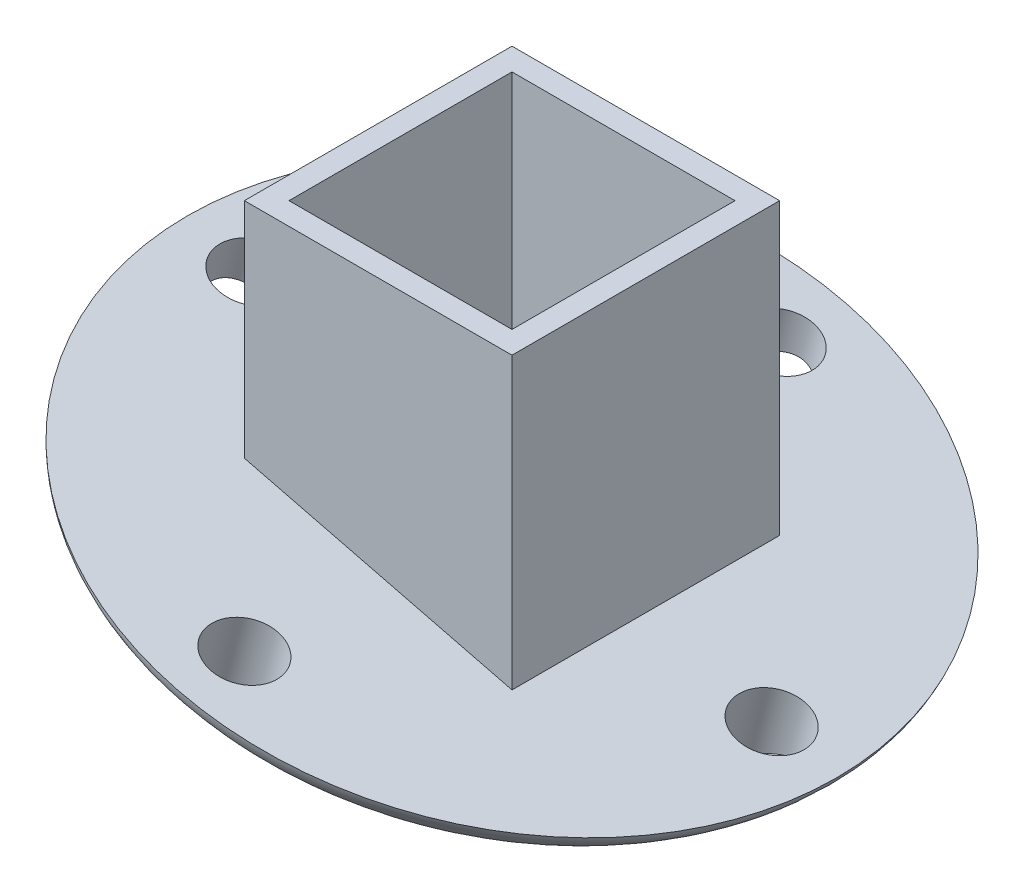
ISO-10303-21;
HEADER;
FILE_DESCRIPTION(('STEP AP214'),'2;1');
FILE_NAME('part.step','',(''),(''),'','','');
FILE_SCHEMA(('AUTOMOTIVE_DESIGN { 1 0 10303 214 1 1 1 1 }'));
ENDSEC;
DATA;
#1=APPLICATION_CONTEXT('core data for automotive mechanical design processes');
#2=APPLICATION_PROTOCOL_DEFINITION('international standard','automotive_design',2000,#1);
#3=PRODUCT_CONTEXT('',#1,'mechanical');
#4=PRODUCT('Part','Part','',(#3));
#5=PRODUCT_RELATED_PRODUCT_CATEGORY('part','',(#4));
#6=PRODUCT_DEFINITION_FORMATION('','',#4);
#7=PRODUCT_DEFINITION_CONTEXT('part definition',#1,'design');
#8=PRODUCT_DEFINITION('design','',#6,#7);
#9=PRODUCT_DEFINITION_SHAPE('','',#8);
#10=(LENGTH_UNIT() NAMED_UNIT(*) SI_UNIT(.MILLI.,.METRE.));
#11=(NAMED_UNIT(*) PLANE_ANGLE_UNIT() SI_UNIT($,.RADIAN.));
#12=(NAMED_UNIT(*) SI_UNIT($,.STERADIAN.) SOLID_ANGLE_UNIT());
#13=UNCERTAINTY_MEASURE_WITH_UNIT(LENGTH_MEASURE(1.E-05),#10,'distance_accuracy_value','');
#14=(GEOMETRIC_REPRESENTATION_CONTEXT(3) GLOBAL_UNCERTAINTY_ASSIGNED_CONTEXT((#13)) GLOBAL_UNIT_ASSIGNED_CONTEXT((#10,
#11,#12)) REPRESENTATION_CONTEXT('',''));
#15=CARTESIAN_POINT('',(0.,0.,0.));
#16=DIRECTION('',(0.,0.,1.));
#17=DIRECTION('',(1.,0.,0.));
#18=AXIS2_PLACEMENT_3D('',#15,#16,#17);
#19=CARTESIAN_POINT('',(-6.,10.,-6.));
#20=DIRECTION('',(0.,0.,1.));
#21=DIRECTION('',(1.,0.,0.));
#22=AXIS2_PLACEMENT_3D('',#19,#20,#21);
#23=PLANE('',#22);
#24=DIRECTION('',(0.970142500145332,-0.242535625036333,0.));
#25=VECTOR('',#24,1.);
#26=CARTESIAN_POINT('',(-0.352941176470588,-1.41176470588235,-6.));
#27=LINE('',#26,#25);
#28=CARTESIAN_POINT('',(-6.,0.,-6.));
#29=VERTEX_POINT('',#28);
#30=CARTESIAN_POINT('',(6.,-3.,-6.));
#31=VERTEX_POINT('',#30);
#32=EDGE_CURVE('E275',#29,#31,#27,.T.);
#33=ORIENTED_EDGE('',*,*,#32,.F.);
#34=DIRECTION('',(0.,-1.,0.));
#35=VECTOR('',#34,1.);
#36=CARTESIAN_POINT('',(-6.,10.,-6.));
#37=LINE('',#36,#35);
#38=CARTESIAN_POINT('',(-6.,10.,-6.));
#39=VERTEX_POINT('',#38);
#40=EDGE_CURVE('E56',#39,#29,#37,.T.);
#41=ORIENTED_EDGE('',*,*,#40,.F.);
#42=DIRECTION('',(-1.,0.,0.));
#43=VECTOR('',#42,1.);
#44=CARTESIAN_POINT('',(-6.,10.,-6.));
#45=LINE('',#44,#43);
#46=CARTESIAN_POINT('',(6.,10.,-6.));
#47=VERTEX_POINT('',#46);
#48=EDGE_CURVE('E207',#47,#39,#45,.T.);
#49=ORIENTED_EDGE('',*,*,#48,.F.);
#50=DIRECTION('',(0.,-1.,0.));
#51=VECTOR('',#50,1.);
#52=CARTESIAN_POINT('',(6.,10.,-6.));
#53=LINE('',#52,#51);
#54=EDGE_CURVE('E11',#47,#31,#53,.T.);
#55=ORIENTED_EDGE('',*,*,#54,.T.);
#56=EDGE_LOOP('',(#33,#41,#49,#55));
#57=FACE_BOUND('',#56,.T.);
#58=ADVANCED_FACE('F41',(#57),#23,.F.);
#59=CARTESIAN_POINT('',(-6.,10.,-6.));
#60=DIRECTION('',(1.,0.,0.));
#61=DIRECTION('',(0.,0.,-1.));
#62=AXIS2_PLACEMENT_3D('',#59,#60,#61);
#63=PLANE('',#62);
#64=DIRECTION('',(0.,0.,1.));
#65=VECTOR('',#64,1.);
#66=CARTESIAN_POINT('',(-6.,0.,-6.));
#67=LINE('',#66,#65);
#68=CARTESIAN_POINT('',(-6.,0.,6.));
#69=VERTEX_POINT('',#68);
#70=EDGE_CURVE('E283',#29,#69,#67,.T.);
#71=ORIENTED_EDGE('',*,*,#70,.T.);
#72=DIRECTION('',(0.,-1.,0.));
#73=VECTOR('',#72,1.);
#74=CARTESIAN_POINT('',(-6.,10.,6.));
#75=LINE('',#74,#73);
#76=CARTESIAN_POINT('',(-6.,10.,6.));
#77=VERTEX_POINT('',#76);
#78=EDGE_CURVE('E219',#77,#69,#75,.T.);
#79=ORIENTED_EDGE('',*,*,#78,.F.);
#80=DIRECTION('',(0.,0.,1.));
#81=VECTOR('',#80,1.);
#82=CARTESIAN_POINT('',(-6.,10.,-6.));
#83=LINE('',#82,#81);
#84=EDGE_CURVE('E210',#39,#77,#83,.T.);
#85=ORIENTED_EDGE('',*,*,#84,.F.);
#86=ORIENTED_EDGE('',*,*,#40,.T.);
#87=EDGE_LOOP('',(#71,#79,#85,#86));
#88=FACE_BOUND('',#87,.T.);
#89=ADVANCED_FACE('F137',(#88),#63,.F.);
#90=CARTESIAN_POINT('',(-6.,10.,6.));
#91=DIRECTION('',(0.,0.,-1.));
#92=DIRECTION('',(-1.,0.,0.));
#93=AXIS2_PLACEMENT_3D('',#90,#91,#92);
#94=PLANE('',#93);
#95=DIRECTION('',(0.970142500145332,-0.242535625036333,0.));
#96=VECTOR('',#95,1.);
#97=CARTESIAN_POINT('',(-0.352941176470588,-1.41176470588235,6.));
#98=LINE('',#97,#96);
#99=CARTESIAN_POINT('',(6.,-3.,6.));
#100=VERTEX_POINT('',#99);
#101=EDGE_CURVE('E271',#69,#100,#98,.T.);
#102=ORIENTED_EDGE('',*,*,#101,.T.);
#103=DIRECTION('',(0.,-1.,0.));
#104=VECTOR('',#103,1.);
#105=CARTESIAN_POINT('',(6.,10.,6.));
#106=LINE('',#105,#104);
#107=CARTESIAN_POINT('',(6.,10.,6.));
#108=VERTEX_POINT('',#107);
#109=EDGE_CURVE('E215',#108,#100,#106,.T.);
#110=ORIENTED_EDGE('',*,*,#109,.F.);
#111=DIRECTION('',(1.,0.,0.));
#112=VECTOR('',#111,1.);
#113=CARTESIAN_POINT('',(-6.,10.,6.));
#114=LINE('',#113,#112);
#115=EDGE_CURVE('E72',#77,#108,#114,.T.);
#116=ORIENTED_EDGE('',*,*,#115,.F.);
#117=ORIENTED_EDGE('',*,*,#78,.T.);
#118=EDGE_LOOP('',(#102,#110,#116,#117));
#119=FACE_BOUND('',#118,.T.);
#120=ADVANCED_FACE('F142',(#119),#94,.F.);
#121=CARTESIAN_POINT('',(0.,10.,0.));
#122=DIRECTION('',(0.,1.,0.));
#123=DIRECTION('',(0.,0.,1.));
#124=AXIS2_PLACEMENT_3D('',#121,#122,#123);
#125=PLANE('',#124);
#126=DIRECTION('',(0.,0.,-1.));
#127=VECTOR('',#126,1.);
#128=CARTESIAN_POINT('',(6.,10.,-6.));
#129=LINE('',#128,#127);
#130=EDGE_CURVE('E204',#108,#47,#129,.T.);
#131=ORIENTED_EDGE('',*,*,#130,.T.);
#132=ORIENTED_EDGE('',*,*,#48,.T.);
#133=ORIENTED_EDGE('',*,*,#84,.T.);
#134=ORIENTED_EDGE('',*,*,#115,.T.);
#135=EDGE_LOOP('',(#131,#132,#133,#134));
#136=FACE_BOUND('',#135,.T.);
#137=DIRECTION('',(-1.,0.,0.));
#138=VECTOR('',#137,1.);
#139=CARTESIAN_POINT('',(-5.00000000000001,10.,-5.));
#140=LINE('',#139,#138);
#141=CARTESIAN_POINT('',(5.,10.,-5.));
#142=VERTEX_POINT('',#141);
#143=CARTESIAN_POINT('',(-5.00000000000001,10.,-5.));
#144=VERTEX_POINT('',#143);
#145=EDGE_CURVE('E185',#142,#144,#140,.T.);
#146=ORIENTED_EDGE('',*,*,#145,.F.);
#147=DIRECTION('',(0.,0.,-1.));
#148=VECTOR('',#147,1.);
#149=CARTESIAN_POINT('',(5.,10.,5.));
#150=LINE('',#149,#148);
#151=CARTESIAN_POINT('',(5.,10.,5.));
#152=VERTEX_POINT('',#151);
#153=EDGE_CURVE('E181',#152,#142,#150,.T.);
#154=ORIENTED_EDGE('',*,*,#153,.F.);
#155=DIRECTION('',(1.,0.,0.));
#156=VECTOR('',#155,1.);
#157=CARTESIAN_POINT('',(-5.00000000000001,10.,5.));
#158=LINE('',#157,#156);
#159=CARTESIAN_POINT('',(-5.00000000000001,10.,5.));
#160=VERTEX_POINT('',#159);
#161=EDGE_CURVE('E194',#160,#152,#158,.T.);
#162=ORIENTED_EDGE('',*,*,#161,.F.);
#163=DIRECTION('',(0.,0.,1.));
#164=VECTOR('',#163,1.);
#165=CARTESIAN_POINT('',(-5.00000000000001,10.,5.));
#166=LINE('',#165,#164);
#167=EDGE_CURVE('E294',#144,#160,#166,.T.);
#168=ORIENTED_EDGE('',*,*,#167,.F.);
#169=EDGE_LOOP('',(#146,#154,#162,#168));
#170=FACE_BOUND('',#169,.T.);
#171=ADVANCED_FACE('F149',(#136,#170),#125,.T.);
#172=CARTESIAN_POINT('',(6.,10.,-6.));
#173=DIRECTION('',(-1.,0.,0.));
#174=DIRECTION('',(0.,0.,1.));
#175=AXIS2_PLACEMENT_3D('',#172,#173,#174);
#176=PLANE('',#175);
#177=ORIENTED_EDGE('',*,*,#109,.T.);
#178=DIRECTION('',(0.,0.,-1.));
#179=VECTOR('',#178,1.);
#180=CARTESIAN_POINT('',(6.,-3.,-6.));
#181=LINE('',#180,#179);
#182=EDGE_CURVE('E288',#100,#31,#181,.T.);
#183=ORIENTED_EDGE('',*,*,#182,.T.);
#184=ORIENTED_EDGE('',*,*,#54,.F.);
#185=ORIENTED_EDGE('',*,*,#130,.F.);
#186=EDGE_LOOP('',(#177,#183,#184,#185));
#187=FACE_BOUND('',#186,.T.);
#188=ADVANCED_FACE('F43',(#187),#176,.F.);
#189=CARTESIAN_POINT('',(5.,10.,5.));
#190=DIRECTION('',(-1.,0.,0.));
#191=DIRECTION('',(0.,0.,1.));
#192=AXIS2_PLACEMENT_3D('',#189,#190,#191);
#193=PLANE('',#192);
#194=DIRECTION('',(0.,0.,-1.));
#195=VECTOR('',#194,1.);
#196=CARTESIAN_POINT('',(5.,0.,5.));
#197=LINE('',#196,#195);
#198=CARTESIAN_POINT('',(5.,0.,5.));
#199=VERTEX_POINT('',#198);
#200=CARTESIAN_POINT('',(5.,0.,-5.));
#201=VERTEX_POINT('',#200);
#202=EDGE_CURVE('E177',#199,#201,#197,.T.);
#203=ORIENTED_EDGE('',*,*,#202,.F.);
#204=DIRECTION('',(0.,-1.,0.));
#205=VECTOR('',#204,1.);
#206=CARTESIAN_POINT('',(5.,10.,5.));
#207=LINE('',#206,#205);
#208=EDGE_CURVE('E191',#152,#199,#207,.T.);
#209=ORIENTED_EDGE('',*,*,#208,.F.);
#210=ORIENTED_EDGE('',*,*,#153,.T.);
#211=DIRECTION('',(0.,-1.,0.));
#212=VECTOR('',#211,1.);
#213=CARTESIAN_POINT('',(5.,10.,-5.));
#214=LINE('',#213,#212);
#215=EDGE_CURVE('E200',#142,#201,#214,.T.);
#216=ORIENTED_EDGE('',*,*,#215,.T.);
#217=EDGE_LOOP('',(#203,#209,#210,#216));
#218=FACE_BOUND('',#217,.T.);
#219=ADVANCED_FACE('F153',(#218),#193,.T.);
#220=CARTESIAN_POINT('',(-5.00000000000001,10.,-5.));
#221=DIRECTION('',(0.,0.,1.));
#222=DIRECTION('',(1.,0.,0.));
#223=AXIS2_PLACEMENT_3D('',#220,#221,#222);
#224=PLANE('',#223);
#225=DIRECTION('',(-1.,0.,0.));
#226=VECTOR('',#225,1.);
#227=CARTESIAN_POINT('',(-5.00000000000001,0.,-5.));
#228=LINE('',#227,#226);
#229=CARTESIAN_POINT('',(-5.00000000000001,0.,-5.));
#230=VERTEX_POINT('',#229);
#231=EDGE_CURVE('E187',#201,#230,#228,.T.);
#232=ORIENTED_EDGE('',*,*,#231,.F.);
#233=ORIENTED_EDGE('',*,*,#215,.F.);
#234=ORIENTED_EDGE('',*,*,#145,.T.);
#235=DIRECTION('',(0.,-1.,0.));
#236=VECTOR('',#235,1.);
#237=CARTESIAN_POINT('',(-5.00000000000001,10.,-5.));
#238=LINE('',#237,#236);
#239=EDGE_CURVE('E197',#144,#230,#238,.T.);
#240=ORIENTED_EDGE('',*,*,#239,.T.);
#241=EDGE_LOOP('',(#232,#233,#234,#240));
#242=FACE_BOUND('',#241,.T.);
#243=ADVANCED_FACE('F156',(#242),#224,.T.);
#244=CARTESIAN_POINT('',(-5.00000000000001,10.,5.));
#245=DIRECTION('',(1.,0.,0.));
#246=DIRECTION('',(0.,0.,-1.));
#247=AXIS2_PLACEMENT_3D('',#244,#245,#246);
#248=PLANE('',#247);
#249=DIRECTION('',(0.,0.,1.));
#250=VECTOR('',#249,1.);
#251=CARTESIAN_POINT('',(-5.00000000000001,0.,5.));
#252=LINE('',#251,#250);
#253=CARTESIAN_POINT('',(-5.00000000000001,0.,5.));
#254=VERTEX_POINT('',#253);
#255=EDGE_CURVE('E179',#230,#254,#252,.T.);
#256=ORIENTED_EDGE('',*,*,#255,.F.);
#257=ORIENTED_EDGE('',*,*,#239,.F.);
#258=ORIENTED_EDGE('',*,*,#167,.T.);
#259=DIRECTION('',(0.,-1.,0.));
#260=VECTOR('',#259,1.);
#261=CARTESIAN_POINT('',(-5.00000000000001,10.,5.));
#262=LINE('',#261,#260);
#263=EDGE_CURVE('E64',#160,#254,#262,.T.);
#264=ORIENTED_EDGE('',*,*,#263,.T.);
#265=EDGE_LOOP('',(#256,#257,#258,#264));
#266=FACE_BOUND('',#265,.T.);
#267=ADVANCED_FACE('F160',(#266),#248,.T.);
#268=CARTESIAN_POINT('',(-5.00000000000001,10.,5.));
#269=DIRECTION('',(0.,0.,-1.));
#270=DIRECTION('',(-1.,0.,0.));
#271=AXIS2_PLACEMENT_3D('',#268,#269,#270);
#272=PLANE('',#271);
#273=DIRECTION('',(1.,0.,0.));
#274=VECTOR('',#273,1.);
#275=CARTESIAN_POINT('',(-5.00000000000001,0.,5.));
#276=LINE('',#275,#274);
#277=EDGE_CURVE('E174',#254,#199,#276,.T.);
#278=ORIENTED_EDGE('',*,*,#277,.F.);
#279=ORIENTED_EDGE('',*,*,#263,.F.);
#280=ORIENTED_EDGE('',*,*,#161,.T.);
#281=ORIENTED_EDGE('',*,*,#208,.T.);
#282=EDGE_LOOP('',(#278,#279,#280,#281));
#283=FACE_BOUND('',#282,.T.);
#284=ADVANCED_FACE('F164',(#283),#272,.T.);
#285=CARTESIAN_POINT('',(-6.,0.,6.));
#286=DIRECTION('',(0.,1.,0.));
#287=DIRECTION('',(0.,0.,1.));
#288=AXIS2_PLACEMENT_3D('',#285,#286,#287);
#289=PLANE('',#288);
#290=ORIENTED_EDGE('',*,*,#277,.T.);
#291=ORIENTED_EDGE('',*,*,#202,.T.);
#292=ORIENTED_EDGE('',*,*,#231,.T.);
#293=ORIENTED_EDGE('',*,*,#255,.T.);
#294=EDGE_LOOP('',(#290,#291,#292,#293));
#295=FACE_BOUND('',#294,.T.);
#296=ADVANCED_FACE('F128',(#295),#289,.T.);
#297=CARTESIAN_POINT('',(-0.352941176470588,-1.41176470588235,0.));
#298=DIRECTION('',(0.242535625036333,0.970142500145332,0.));
#299=DIRECTION('',(-0.970142500145332,0.242535625036333,0.));
#300=AXIS2_PLACEMENT_3D('',#297,#298,#299);
#301=PLANE('',#300);
#302=CARTESIAN_POINT('',(0.00015603088864718,-1.50003900772216,-12.0001638046084));
#303=DIRECTION('',(0.242535625036333,0.970142500145332,0.));
#304=DIRECTION('',(-0.970142500145332,0.242535625036333,0.));
#305=AXIS2_PLACEMENT_3D('',#302,#303,#304);
#306=CIRCLE('',#305,1.5);
#307=CARTESIAN_POINT('',(-1.45505771932935,-1.13623557016766,-12.0001638046084));
#308=VERTEX_POINT('',#307);
#309=EDGE_CURVE('E234',#308,#308,#306,.T.);
#310=ORIENTED_EDGE('',*,*,#309,.F.);
#311=EDGE_LOOP('',(#310));
#312=FACE_BOUND('',#311,.T.);
#313=CARTESIAN_POINT('',(11.6418660326326,-4.41046650815816,-0.000163804608414419));
#314=DIRECTION('',(0.242535625036333,0.970142500145332,0.));
#315=DIRECTION('',(-0.970142500145332,0.242535625036333,0.));
#316=AXIS2_PLACEMENT_3D('',#313,#314,#315);
#317=CIRCLE('',#316,1.5);
#318=CARTESIAN_POINT('',(10.1866522824146,-4.04666307060366,-0.000163804608414419));
#319=VERTEX_POINT('',#318);
#320=EDGE_CURVE('E422',#319,#319,#317,.T.);
#321=ORIENTED_EDGE('',*,*,#320,.F.);
#322=EDGE_LOOP('',(#321));
#323=FACE_BOUND('',#322,.T.);
#324=CARTESIAN_POINT('',(0.00015603088864718,-1.50003900772216,11.9998361953916));
#325=DIRECTION('',(0.242535625036333,0.970142500145332,0.));
#326=DIRECTION('',(-0.970142500145332,0.242535625036333,0.));
#327=AXIS2_PLACEMENT_3D('',#324,#325,#326);
#328=CIRCLE('',#327,1.5);
#329=CARTESIAN_POINT('',(-1.45505771932935,-1.13623557016766,11.9998361953916));
#330=VERTEX_POINT('',#329);
#331=EDGE_CURVE('E426',#330,#330,#328,.T.);
#332=ORIENTED_EDGE('',*,*,#331,.F.);
#333=EDGE_LOOP('',(#332));
#334=FACE_BOUND('',#333,.T.);
#335=CARTESIAN_POINT('',(-11.6415539708553,1.41038849271383,-0.000163804608414419));
#336=DIRECTION('',(0.242535625036333,0.970142500145332,0.));
#337=DIRECTION('',(-0.970142500145332,0.242535625036333,0.));
#338=AXIS2_PLACEMENT_3D('',#335,#336,#337);
#339=CIRCLE('',#338,1.5);
#340=CARTESIAN_POINT('',(-13.0967677210733,1.77419193026833,-0.000163804608414419));
#341=VERTEX_POINT('',#340);
#342=EDGE_CURVE('E431',#341,#341,#339,.T.);
#343=ORIENTED_EDGE('',*,*,#342,.F.);
#344=EDGE_LOOP('',(#343));
#345=FACE_BOUND('',#344,.T.);
#346=CARTESIAN_POINT('',(0.,-1.5,0.));
#347=DIRECTION('',(0.242535625036333,0.970142500145332,0.));
#348=DIRECTION('',(-0.970142500145332,0.242535625036333,0.));
#349=AXIS2_PLACEMENT_3D('',#346,#347,#348);
#350=CIRCLE('',#349,15.);
#351=CARTESIAN_POINT('',(-14.55213750218,2.13803437554499,0.));
#352=VERTEX_POINT('',#351);
#353=EDGE_CURVE('E259',#352,#352,#350,.T.);
#354=ORIENTED_EDGE('',*,*,#353,.T.);
#355=EDGE_LOOP('',(#354));
#356=FACE_BOUND('',#355,.T.);
#357=ORIENTED_EDGE('',*,*,#32,.T.);
#358=ORIENTED_EDGE('',*,*,#182,.F.);
#359=ORIENTED_EDGE('',*,*,#101,.F.);
#360=ORIENTED_EDGE('',*,*,#70,.F.);
#361=EDGE_LOOP('',(#357,#358,#359,#360));
#362=FACE_BOUND('',#361,.T.);
#363=ADVANCED_FACE('F119',(#312,#323,#334,#345,#356,#362),#301,.T.);
#364=CARTESIAN_POINT('',(-1.21267812518167,-6.35071250072666,0.));
#365=CARTESIAN_POINT('',(4.87585189508166,-8.18182814171305,0.));
#366=CARTESIAN_POINT('',(13.570451870267,-7.28992498295824,0.));
#367=CARTESIAN_POINT('',(14.55213750218,-5.13803437554499,0.));
#368=B_SPLINE_CURVE_WITH_KNOTS('',3,(#364,#365,#366,#367),.UNSPECIFIED.,.F.,.F.,(4,4),(0.,1.),.UNSPECIFIED.);
#369=CARTESIAN_POINT('',(0.,-1.5,0.));
#370=DIRECTION('',(0.242535625036333,0.970142500145332,0.));
#371=AXIS1_PLACEMENT('',#369,#370);
#372=SURFACE_OF_REVOLUTION('',#368,#371);
#373=CARTESIAN_POINT('',(-2.06508250236672,-3.57633470231713,-12.0001638046084));
#374=CARTESIAN_POINT('',(-2.07570926135557,-3.61885405525407,-11.9097810736468));
#375=CARTESIAN_POINT('',(-2.0782999157834,-3.66294645538454,-11.8191109238702));
#376=CARTESIAN_POINT('',(-2.06697564977122,-3.75328785753917,-11.6397742327925));
#377=CARTESIAN_POINT('',(-2.0530410372454,-3.799539369293,-11.5511102104724));
#378=CARTESIAN_POINT('',(-2.00844271684533,-3.8932190876555,-11.3783885537887));
#379=CARTESIAN_POINT('',(-1.97773702585009,-3.94064996096369,-11.2943430645785));
#380=CARTESIAN_POINT('',(-1.89982253121877,-4.03531391825591,-11.1341530928361));
#381=CARTESIAN_POINT('',(-1.8526226915812,-4.08254709559935,-11.0580043477874));
#382=CARTESIAN_POINT('',(-1.7461267779568,-4.17238735386059,-10.921321265508));
#383=CARTESIAN_POINT('',(-1.68780432187643,-4.21509655319141,-10.860097539401));
#384=CARTESIAN_POINT('',(-1.55881048932638,-4.29771640283371,-10.749995209712));
#385=CARTESIAN_POINT('',(-1.48814692242145,-4.33762880073732,-10.7011088464878));
#386=CARTESIAN_POINT('',(-1.3436312162053,-4.40968003696713,-10.6219482513085));
#387=CARTESIAN_POINT('',(-1.27068131122901,-4.44219649212093,-10.590369108904));
#388=CARTESIAN_POINT('',(-1.11852146548128,-4.50261169852462,-10.5408137984953));
#389=CARTESIAN_POINT('',(-1.03931484475961,-4.53051287481663,-10.5228304688867));
#390=CARTESIAN_POINT('',(-0.883098362674248,-4.57889380094717,-10.5021152587698));
#391=CARTESIAN_POINT('',(-0.806340742414625,-4.59976318008784,-10.4983787736533));
#392=CARTESIAN_POINT('',(-0.651971752357561,-4.63603739104789,-10.5035274954151));
#393=CARTESIAN_POINT('',(-0.574360553006626,-4.65144329412232,-10.5124102262597));
#394=CARTESIAN_POINT('',(-0.422429379076436,-4.6760712616145,-10.5420428657619));
#395=CARTESIAN_POINT('',(-0.348075083012574,-4.68543240403952,-10.5625038848067));
#396=CARTESIAN_POINT('',(-0.202719328477029,-4.6983759691424,-10.6142526209622));
#397=CARTESIAN_POINT('',(-0.131718128479358,-4.70195794703584,-10.645541171172));
#398=CARTESIAN_POINT('',(0.00715884954159278,-4.70338438524486,-10.7188152099125));
#399=CARTESIAN_POINT('',(0.0748894227351547,-4.70106369549137,-10.7610782271913));
#400=CARTESIAN_POINT('',(0.203511548616489,-4.69054028068598,-10.8543488292724));
#401=CARTESIAN_POINT('',(0.264401360912113,-4.68233606267838,-10.9053586310864));
#402=CARTESIAN_POINT('',(0.382077154369427,-4.65963000666649,-11.0182481675976));
#403=CARTESIAN_POINT('',(0.438305722853431,-4.6447392089265,-11.0806301668456));
#404=CARTESIAN_POINT('',(0.540732634905144,-4.60913962801605,-11.2116297642729));
#405=CARTESIAN_POINT('',(0.586927484416796,-4.58842882387699,-11.2802495228739));
#406=CARTESIAN_POINT('',(0.67220914782978,-4.53972447708158,-11.4280244476037));
#407=CARTESIAN_POINT('',(0.710341661490256,-4.51125746211514,-11.5075780327075));
#408=CARTESIAN_POINT('',(0.757763445164942,-4.46451578951361,-11.6290486106142));
#409=CARTESIAN_POINT('',(0.771944401506497,-4.44825542005135,-11.6699099220132));
#410=CARTESIAN_POINT('',(0.79704557197021,-4.41446245939526,-11.7521495677205));
#411=CARTESIAN_POINT('',(0.80796302529689,-4.39692880654929,-11.7935283091019));
#412=CARTESIAN_POINT('',(0.837212534791551,-4.33973901906409,-11.9245223619297));
#413=CARTESIAN_POINT('',(0.849531271289291,-4.29793520402797,-12.0146159781257));
#414=CARTESIAN_POINT('',(0.858735764142675,-4.20994733329772,-12.1934543029685));
#415=CARTESIAN_POINT('',(0.855617515487223,-4.16376214393726,-12.282198655568));
#416=CARTESIAN_POINT('',(0.839219983847563,-4.09102077743255,-12.414445754568));
#417=CARTESIAN_POINT('',(0.831499061888499,-4.06561385575469,-12.4593306623922));
#418=CARTESIAN_POINT('',(0.81191277073509,-4.01412292139423,-12.5477257195155));
#419=CARTESIAN_POINT('',(0.800051319545441,-3.98803957031146,-12.5912371262053));
#420=CARTESIAN_POINT('',(0.758257239183354,-3.90898440838488,-12.7193304565994));
#421=CARTESIAN_POINT('',(0.722112179252508,-3.85519538875965,-12.8014934878128));
#422=CARTESIAN_POINT('',(0.634475403005637,-3.74834230518075,-12.9549661355103));
#423=CARTESIAN_POINT('',(0.583278303061206,-3.69528311290004,-13.026447638002));
#424=CARTESIAN_POINT('',(0.46588683741277,-3.5909985158439,-13.1575384188019));
#425=CARTESIAN_POINT('',(0.399701329655897,-3.53977204857553,-13.2171546703722));
#426=CARTESIAN_POINT('',(0.260652677562865,-3.44656119051237,-13.31638787641));
#427=CARTESIAN_POINT('',(0.189055443591069,-3.40416214823099,-13.3573818582202));
#428=CARTESIAN_POINT('',(0.0363767667366677,-3.3253422028003,-13.4248617563238));
#429=CARTESIAN_POINT('',(-0.0446909672050028,-3.28891283754552,-13.4513683354901));
#430=CARTESIAN_POINT('',(-0.201710774717878,-3.22876099159879,-13.4855245568913));
#431=CARTESIAN_POINT('',(-0.276799485034982,-3.20397491237458,-13.495288523835));
#432=CARTESIAN_POINT('',(-0.429520606184575,-3.16154849974178,-13.5021903689893));
#433=CARTESIAN_POINT('',(-0.507151697605604,-3.14390452140192,-13.499334696453));
#434=CARTESIAN_POINT('',(-0.655938474797681,-3.11740045326152,-13.4819318975352));
#435=CARTESIAN_POINT('',(-0.727105490328196,-3.10794093674788,-13.4683581068292));
#436=CARTESIAN_POINT('',(-0.867405491036786,-3.095396077888,-13.4313894574142));
#437=CARTESIAN_POINT('',(-0.936538247364744,-3.09231145002205,-13.4079934982166));
#438=CARTESIAN_POINT('',(-1.07352168057487,-3.0921106798103,-13.351364897947));
#439=CARTESIAN_POINT('',(-1.14123917722463,-3.09521084719031,-13.3178118246943));
#440=CARTESIAN_POINT('',(-1.27134908554642,-3.10715503073513,-13.2424601344271));
#441=CARTESIAN_POINT('',(-1.33373973150647,-3.11600094316535,-13.2006587984147));
#442=CARTESIAN_POINT('',(-1.45891752343635,-3.14001955988875,-13.1048940750252));
#443=CARTESIAN_POINT('',(-1.52094318809346,-3.15579726208727,-13.0500882578083));
#444=CARTESIAN_POINT('',(-1.63614046366241,-3.19266963120245,-12.9333954597378));
#445=CARTESIAN_POINT('',(-1.68930546776478,-3.21376823636731,-12.8715032525247));
#446=CARTESIAN_POINT('',(-1.79208432830925,-3.26338719438765,-12.7340494070071));
#447=CARTESIAN_POINT('',(-1.84041887026471,-3.2925061992532,-12.6577466651803));
#448=CARTESIAN_POINT('',(-1.92407066415542,-3.3554078665341,-12.5001805700517));
#449=CARTESIAN_POINT('',(-1.95939743355715,-3.38918709420241,-12.4189208945652));
#450=CARTESIAN_POINT('',(-2.00689446611083,-3.4485775392406,-12.2811271021007));
#451=CARTESIAN_POINT('',(-2.02285782377137,-3.47314031363358,-12.2254166615751));
#452=CARTESIAN_POINT('',(-2.0486252899828,-3.52370801592576,-12.1132296710625));
#453=CARTESIAN_POINT('',(-2.05842901320878,-3.5497130339359,-12.0567530733732));
#454=CARTESIAN_POINT('',(-2.06508250236672,-3.57633470231713,-12.0001638046084));
#455=B_SPLINE_CURVE_WITH_KNOTS('',3,(#373,#374,#375,#376,#377,#378,#379,#380,#381,#382,#383,
#384,#385,#386,#387,#388,#389,#390,#391,#392,#393,#394,#395,#396,#397,#398,#399,#400,#401,#402,
#403,#404,#405,#406,#407,#408,#409,#410,#411,#412,#413,#414,#415,#416,#417,#418,#419,#420,#421,
#422,#423,#424,#425,#426,#427,#428,#429,#430,#431,#432,#433,#434,#435,#436,#437,#438,#439,#440,
#441,#442,#443,#444,#445,#446,#447,#448,#449,#450,#451,#452,#453,#454),.UNSPECIFIED.,.T.,.F.,(4,
2,2,2,2,2,2,2,2,2,2,2,2,2,2,2,2,2,2,2,2,2,2,2,2,2,2,2,2,2,2,2,2,2,2,2,2,2,2,2,4),(0.,
0.301127380287923,0.60261395534899,0.904858725454481,1.20693949079638,1.48958511035166,
1.77205251307275,2.02834522657351,2.28450284345621,2.5222226579133,2.75989583547992,
2.99188494724983,3.2238919128496,3.46246114291527,3.70109093177545,3.95588576548274,
4.21076918500451,4.48759546527642,4.62610389111868,4.76472916019406,5.06356802167173,
5.36248441873413,5.51877091816581,5.67490992950858,5.98711317515048,6.29357186941668,
6.59984992119176,6.87649061326487,7.15273570592168,7.39045408750072,7.62805099741281,
7.84625416830154,8.0644817934859,8.29047558222865,8.51654399351258,8.76831632470396,
9.02027555405783,9.30380020281509,9.58711698940583,9.77564318515977,9.96418117327128),.UNSPECIFIED.);
#456=CARTESIAN_POINT('',(-2.06508250236672,-3.57633470231713,-12.0001638046084));
#457=VERTEX_POINT('',#456);
#458=EDGE_CURVE('E45',#457,#457,#455,.T.);
#459=ORIENTED_EDGE('',*,*,#458,.T.);
#460=EDGE_LOOP('',(#459));
#461=FACE_BOUND('',#460,.T.);
#462=CARTESIAN_POINT('',(9.41005322576052,-7.15305933409709,0.));
#463=CARTESIAN_POINT('',(9.41006941899355,-7.15305722646124,0.0789878514329336));
#464=CARTESIAN_POINT('',(9.41682803571438,-7.15192191873802,0.15807255495309));
#465=CARTESIAN_POINT('',(9.43684575338882,-7.1485476885247,0.274869803251598));
#466=CARTESIAN_POINT('',(9.44517802557453,-7.14714219376934,0.313534360978657));
#467=CARTESIAN_POINT('',(9.46505253013118,-7.14378323416358,0.390038769759902));
#468=CARTESIAN_POINT('',(9.47659700261086,-7.1418293868975,0.42787802533781));
#469=CARTESIAN_POINT('',(9.51580316098304,-7.13517832476997,0.539478705091778));
#470=CARTESIAN_POINT('',(9.54808892800292,-7.12968301685159,0.611617366305611));
#471=CARTESIAN_POINT('',(9.62377735015598,-7.11670535025652,0.749614342506858));
#472=CARTESIAN_POINT('',(9.66718488838031,-7.10922211871483,0.815469881371066));
#473=CARTESIAN_POINT('',(9.74023606811729,-7.09651059865532,0.909441278611763));
#474=CARTESIAN_POINT('',(9.76639645951258,-7.09193976012974,0.940417701257967));
#475=CARTESIAN_POINT('',(9.82102153335799,-7.08234670226048,1.0001339442402));
#476=CARTESIAN_POINT('',(9.84948387663127,-7.07732494057355,1.02887597825304));
#477=CARTESIAN_POINT('',(9.93806417760001,-7.06160831980705,1.11162159079718));
#478=CARTESIAN_POINT('',(10.0013744498168,-7.05026229047599,1.16214345997597));
#479=CARTESIAN_POINT('',(10.1398494479203,-7.02510489596261,1.25660327331421));
#480=CARTESIAN_POINT('',(10.2155550596085,-7.01116975942925,1.2997096489434));
#481=CARTESIAN_POINT('',(10.3724868815052,-6.98179077077821,1.37357756151257));
#482=CARTESIAN_POINT('',(10.45371515095,-6.96634635494555,1.40433446385053));
#483=CARTESIAN_POINT('',(10.6268508985039,-6.93279696203409,1.45535287350182));
#484=CARTESIAN_POINT('',(10.7190747014705,-6.91457740439292,1.47447801266119));
#485=CARTESIAN_POINT('',(10.8585283892854,-6.88639492343527,1.49196557195616));
#486=CARTESIAN_POINT('',(10.9052145411815,-6.87685535347992,1.49592753542201));
#487=CARTESIAN_POINT('',(10.9987472226663,-6.85751916715756,1.50014662454431));
#488=CARTESIAN_POINT('',(11.0455938614514,-6.8477223186034,1.50040027978883));
#489=CARTESIAN_POINT('',(11.1921876867792,-6.81668894057617,1.49539846142353));
#490=CARTESIAN_POINT('',(11.2917024778734,-6.79507386572368,1.48357185346583));
#491=CARTESIAN_POINT('',(11.4872522243262,-6.75140342231851,1.44340817983025));
#492=CARTESIAN_POINT('',(11.5832869938289,-6.72934803034729,1.41507023371492));
#493=CARTESIAN_POINT('',(11.7236465884317,-6.69618770663447,1.36021867868713));
#494=CARTESIAN_POINT('',(11.7703097846485,-6.68499784681054,1.33957926414588));
#495=CARTESIAN_POINT('',(11.8616020930625,-6.6627863798622,1.29424312401964));
#496=CARTESIAN_POINT('',(11.9062330588596,-6.65176462576973,1.26955019434035));
#497=CARTESIAN_POINT('',(12.0366040382183,-6.6190976263641,1.18946244331407));
#498=CARTESIAN_POINT('',(12.1188685778087,-6.5978396295802,1.12804064593072));
#499=CARTESIAN_POINT('',(12.2666524902816,-6.55862905131694,0.993863324228971));
#500=CARTESIAN_POINT('',(12.3328114770283,-6.54056324284036,0.921844694812341));
#501=CARTESIAN_POINT('',(12.4503732330309,-6.5077769554041,0.76593354127267));
#502=CARTESIAN_POINT('',(12.5017924165686,-6.49305275905454,0.682054381789754));
#503=CARTESIAN_POINT('',(12.5813784908132,-6.46992481933791,0.515933519209379));
#504=CARTESIAN_POINT('',(12.6116346441623,-6.46096460346625,0.43477231002807));
#505=CARTESIAN_POINT('',(12.6564178996233,-6.44761519595767,0.267880740810395));
#506=CARTESIAN_POINT('',(12.6709633200424,-6.44322068106028,0.182155824633027));
#507=CARTESIAN_POINT('',(12.6825252210281,-6.4397287530049,0.0205397383611952));
#508=CARTESIAN_POINT('',(12.6815528192651,-6.44002358024045,-0.0552005940572943));
#509=CARTESIAN_POINT('',(12.6669774871771,-6.44441839214482,-0.205332521603643));
#510=CARTESIAN_POINT('',(12.6533764943715,-6.44851779310355,-0.279724321842729));
#511=CARTESIAN_POINT('',(12.6149514955669,-6.45996972184811,-0.422571469818561));
#512=CARTESIAN_POINT('',(12.5905167753756,-6.46720923591546,-0.49114204763904));
#513=CARTESIAN_POINT('',(12.5316576218493,-6.48439387766769,-0.623468531154467));
#514=CARTESIAN_POINT('',(12.4972309362561,-6.49433961532253,-0.687223347255574));
#515=CARTESIAN_POINT('',(12.416736806023,-6.51718845805745,-0.813367719862113));
#516=CARTESIAN_POINT('',(12.3699858912333,-6.53025833948203,-0.875289356566794));
#517=CARTESIAN_POINT('',(12.2679668492576,-6.55817953018365,-0.991343793545477));
#518=CARTESIAN_POINT('',(12.2126834794224,-6.57303401680071,-1.04546231269153));
#519=CARTESIAN_POINT('',(12.0877895720236,-6.60584505013603,-1.15141752066844));
#520=CARTESIAN_POINT('',(12.0172516388381,-6.62395685421819,-1.20211320431685));
#521=CARTESIAN_POINT('',(11.8694270745572,-6.66094143141662,-1.29201892052654));
#522=CARTESIAN_POINT('',(11.792139812545,-6.67981427558481,-1.33122787783101));
#523=CARTESIAN_POINT('',(11.6236792125997,-6.71991288144688,-1.40145981057247));
#524=CARTESIAN_POINT('',(11.5319209822921,-6.74116496166406,-1.43106989719993));
#525=CARTESIAN_POINT('',(11.3446971474319,-6.78336478003023,-1.4750684025757));
#526=CARTESIAN_POINT('',(11.2492286006247,-6.80431225776778,-1.48944447455979));
#527=CARTESIAN_POINT('',(11.0515460701876,-6.84660403708092,-1.50296834804754));
#528=CARTESIAN_POINT('',(10.9492585273808,-6.86790253754032,-1.50119837154761));
#529=CARTESIAN_POINT('',(10.7463617096627,-6.90914205695501,-1.47995272908423));
#530=CARTESIAN_POINT('',(10.6457498863952,-6.92908531330191,-1.46050704698847));
#531=CARTESIAN_POINT('',(10.4989915691157,-6.95756977380672,-1.41831167436627));
#532=CARTESIAN_POINT('',(10.4509947450135,-6.96678370256284,-1.40218776032347));
#533=CARTESIAN_POINT('',(10.3565913703378,-6.98472963101787,-1.36569228989535));
#534=CARTESIAN_POINT('',(10.3101837815173,-6.99346194772211,-1.34532357075041));
#535=CARTESIAN_POINT('',(10.1739349917378,-7.01886779687067,-1.27790555278825));
#536=CARTESIAN_POINT('',(10.0869638330819,-7.03477027344816,-1.22451483952593));
#537=CARTESIAN_POINT('',(9.93006783517018,-7.06305101479725,-1.10614929670501));
#538=CARTESIAN_POINT('',(9.85938424690797,-7.07559585130661,-1.04221544185555));
#539=CARTESIAN_POINT('',(9.73086649514072,-7.09817117655187,-0.902077782579535));
#540=CARTESIAN_POINT('',(9.67302773494931,-7.10820256492274,-0.82587838442705));
#541=CARTESIAN_POINT('',(9.57765379474047,-7.12462558894528,-0.671038353902304));
#542=CARTESIAN_POINT('',(9.53873664367807,-7.13126784269614,-0.593273406239242));
#543=CARTESIAN_POINT('',(9.47562389619068,-7.14199723427861,-0.431915616295246));
#544=CARTESIAN_POINT('',(9.45139699579779,-7.14608980583176,-0.348335592557288));
#545=CARTESIAN_POINT('',(9.4267650501151,-7.15024486810756,-0.219934533123465));
#546=CARTESIAN_POINT('',(9.4205041623017,-7.15129947505274,-0.176196188824909));
#547=CARTESIAN_POINT('',(9.41214376839412,-7.15270728959544,-0.0883153203337027));
#548=CARTESIAN_POINT('',(9.41004416993087,-7.15306051276173,-0.0441728051343744));
#549=CARTESIAN_POINT('',(9.41005322576052,-7.15305933409709,0.));
#550=B_SPLINE_CURVE_WITH_KNOTS('',3,(#462,#463,#464,#465,#466,#467,#468,#469,#470,#471,#472,
#473,#474,#475,#476,#477,#478,#479,#480,#481,#482,#483,#484,#485,#486,#487,#488,#489,#490,#491,
#492,#493,#494,#495,#496,#497,#498,#499,#500,#501,#502,#503,#504,#505,#506,#507,#508,#509,#510,
#511,#512,#513,#514,#515,#516,#517,#518,#519,#520,#521,#522,#523,#524,#525,#526,#527,#528,#529,
#530,#531,#532,#533,#534,#535,#536,#537,#538,#539,#540,#541,#542,#543,#544,#545,#546,#547,#548,
#549),.UNSPECIFIED.,.T.,.F.,(4,2,2,2,2,2,2,2,2,2,2,2,2,2,2,2,2,2,2,2,2,2,2,2,2,2,2,2,2,2,2,2,2,
2,2,2,2,2,2,2,2,2,2,4),(0.,0.236766207332289,0.355382773665918,0.474082268471434,
0.710596221671704,0.947214196451925,1.06950612540089,1.19167530965077,1.43601830299113,
1.69959944043343,1.96327940431244,2.24974076633482,2.39306405391567,2.53652146169695,
2.84260281107552,3.14870048318623,3.30523352219046,3.46162080372339,3.77424439420619,
4.07093987464661,4.36730365920308,4.62701415366884,4.88642150445775,5.11251708215212,
5.33857797726011,5.5571021458478,5.77567560960434,6.01077967011377,6.24630869601911,
6.51143007860703,6.77657627092207,7.07148476485524,7.3666320919099,7.67865633106476,
7.99015225923581,8.14436830754197,8.29848160610249,8.60638319371401,8.89324339696155,
9.18000077759122,9.44026971736237,9.69998207382,9.83239306499655,9.96480111698382),.UNSPECIFIED.);
#551=CARTESIAN_POINT('',(9.41005322576052,-7.15305933409709,0.));
#552=VERTEX_POINT('',#551);
#553=EDGE_CURVE('E250',#552,#552,#550,.T.);
#554=ORIENTED_EDGE('',*,*,#553,.T.);
#555=EDGE_LOOP('',(#554));
#556=FACE_BOUND('',#555,.T.);
#557=CARTESIAN_POINT('',(-2.06512103091131,-3.57648881649551,11.9998361953916));
#558=CARTESIAN_POINT('',(-2.05413850682103,-3.53257039095086,12.0931985440923));
#559=CARTESIAN_POINT('',(-2.03456048595209,-3.49025805666319,12.186408495798));
#560=CARTESIAN_POINT('',(-1.97880636583176,-3.4099386431276,12.3698170251453));
#561=CARTESIAN_POINT('',(-1.94260154906412,-3.37193915515292,12.4600101017499));
#562=CARTESIAN_POINT('',(-1.85435450914285,-3.30141406201767,12.6347425448698));
#563=CARTESIAN_POINT('',(-1.8023003977539,-3.26889259434828,12.7192776091647));
#564=CARTESIAN_POINT('',(-1.68340065639661,-3.21069539976111,12.8799048284154));
#565=CARTESIAN_POINT('',(-1.61655990998528,-3.18501741881535,12.9559997584512));
#566=CARTESIAN_POINT('',(-1.4725229383914,-3.14295526321197,13.0939961900686));
#567=CARTESIAN_POINT('',(-1.39586287209687,-3.12623355910869,13.1563513171244));
#568=CARTESIAN_POINT('',(-1.23211996668325,-3.10215620145348,13.267836804884));
#569=CARTESIAN_POINT('',(-1.14504700748883,-3.09479174553188,13.3169795601063));
#570=CARTESIAN_POINT('',(-0.974156592124004,-3.09123945218843,13.3942780701894));
#571=CARTESIAN_POINT('',(-0.8911819987024,-3.09382738239095,13.4242338904204));
#572=CARTESIAN_POINT('',(-0.722188400245242,-3.10829052282776,13.4698551245053));
#573=CARTESIAN_POINT('',(-0.636173341635563,-3.12015408773004,13.4855384037952));
#574=CARTESIAN_POINT('',(-0.475906200956635,-3.15101482426683,13.5005091064919));
#575=CARTESIAN_POINT('',(-0.4016033473009,-3.1688606395993,13.5016911076656));
#576=CARTESIAN_POINT('',(-0.255613342975216,-3.21103271563935,13.4924659137538));
#577=CARTESIAN_POINT('',(-0.18392563521414,-3.23535758687266,13.4820612019917));
#578=CARTESIAN_POINT('',(-0.0482930432983361,-3.28829648145056,13.4509306834838));
#579=CARTESIAN_POINT('',(0.0158532887912681,-3.31667666865743,13.4306756859755));
#580=CARTESIAN_POINT('',(0.138470194082145,-3.37734837790592,13.3809874462854));
#581=CARTESIAN_POINT('',(0.196939611194158,-3.40964069364541,13.3515523397174));
#582=CARTESIAN_POINT('',(0.310997037884445,-3.47930441817856,13.2823015113856));
#583=CARTESIAN_POINT('',(0.366116889224624,-3.51687200258051,13.2419149226687));
#584=CARTESIAN_POINT('',(0.468121909594272,-3.59396624933677,13.1532204228707));
#585=CARTESIAN_POINT('',(0.514992615734824,-3.63349619972957,13.1048988808254));
#586=CARTESIAN_POINT('',(0.605243060568722,-3.71832714882112,12.9952920989265));
#587=CARTESIAN_POINT('',(0.647471158239977,-3.76373645755442,12.933142478077));
#588=CARTESIAN_POINT('',(0.720511514267356,-3.85429798577502,12.8023017507666));
#589=CARTESIAN_POINT('',(0.75131840308975,-3.89945007453655,12.7336075865012));
#590=CARTESIAN_POINT('',(0.804203764018699,-3.9936123849618,12.5830204096814));
#591=CARTESIAN_POINT('',(0.824851265858986,-4.04246094079816,12.5005213622416));
#592=CARTESIAN_POINT('',(0.851433483186757,-4.13720185436064,12.3316882329448));
#593=CARTESIAN_POINT('',(0.857382187253807,-4.18309698225619,12.2453578770057));
#594=CARTESIAN_POINT('',(0.854415327671326,-4.27368281424819,12.0654290474803));
#595=CARTESIAN_POINT('',(0.844541851224705,-4.31811644161779,11.9717148330612));
#596=CARTESIAN_POINT('',(0.808104699969242,-4.40130471546836,11.7849830550481));
#597=CARTESIAN_POINT('',(0.781539205104049,-4.44005874209138,11.6919655685429));
#598=CARTESIAN_POINT('',(0.712179855330306,-4.51053169220071,11.5101044651523));
#599=CARTESIAN_POINT('',(0.669489959225314,-4.54229366175766,11.4212381242516));
#600=CARTESIAN_POINT('',(0.56847420253624,-4.59801498429524,11.2501605151172));
#601=CARTESIAN_POINT('',(0.51015339468867,-4.62197685314718,11.1679471074652));
#602=CARTESIAN_POINT('',(0.38329883785347,-4.6598432269547,11.0184835413893));
#603=CARTESIAN_POINT('',(0.315664629127439,-4.6742960277737,10.9506107307851));
#604=CARTESIAN_POINT('',(0.169361038283602,-4.69479708539802,10.8264597880746));
#605=CARTESIAN_POINT('',(0.0906989775448194,-4.700850889467,10.770174024045));
#606=CARTESIAN_POINT('',(-0.0676094914963112,-4.70394213892764,10.6764664687033));
#607=CARTESIAN_POINT('',(-0.146493673978435,-4.7017608441932,10.6377823782723));
#608=CARTESIAN_POINT('',(-0.309050731714903,-4.68999041348093,10.5739842393977));
#609=CARTESIAN_POINT('',(-0.392720748860063,-4.68040565696556,10.5488621833546));
#610=CARTESIAN_POINT('',(-0.55522512835225,-4.65510748401291,10.5148566291167));
#611=CARTESIAN_POINT('',(-0.63390843579936,-4.63994786519684,10.5048313822879));
#612=CARTESIAN_POINT('',(-0.790554522317461,-4.60397346587746,10.4977516866226));
#613=CARTESIAN_POINT('',(-0.868517491482939,-4.58316022413206,10.5006937117702));
#614=CARTESIAN_POINT('',(-1.01852721778001,-4.53738803101773,10.5190633224557));
#615=CARTESIAN_POINT('',(-1.09068607207058,-4.51260868978236,10.5340300031367));
#616=CARTESIAN_POINT('',(-1.23015751336442,-4.4591408409156,10.5752490174673));
#617=CARTESIAN_POINT('',(-1.29746997305677,-4.43045223064803,10.6015016474636));
#618=CARTESIAN_POINT('',(-1.42663733818684,-4.36947754455831,10.6648017743977));
#619=CARTESIAN_POINT('',(-1.48838345997165,-4.337139780268,10.7020207668191));
#620=CARTESIAN_POINT('',(-1.60377617788494,-4.27012996745618,10.7857276430709));
#621=CARTESIAN_POINT('',(-1.65742139071839,-4.23545752172737,10.8322171067705));
#622=CARTESIAN_POINT('',(-1.75857237264275,-4.16248390402765,10.9359810752277));
#623=CARTESIAN_POINT('',(-1.80551769528267,-4.12408978539631,10.9937348881728));
#624=CARTESIAN_POINT('',(-1.88848455637483,-4.04647696596571,11.1161818592362));
#625=CARTESIAN_POINT('',(-1.92449960959212,-4.0072577903346,11.1808791063966));
#626=CARTESIAN_POINT('',(-1.97128163255828,-3.94678845438031,11.2845600875007));
#627=CARTESIAN_POINT('',(-1.98606427250288,-3.92551966073715,11.3217786027694));
#628=CARTESIAN_POINT('',(-2.01225565572706,-3.88311503987032,11.3974056769738));
#629=CARTESIAN_POINT('',(-2.02366738395808,-3.86197911132712,11.4358131495816));
#630=CARTESIAN_POINT('',(-2.05282636029154,-3.79892013427245,11.5524440132058));
#631=CARTESIAN_POINT('',(-2.06553646259255,-3.7572950288435,11.6321634345543));
#632=CARTESIAN_POINT('',(-2.07508799907949,-3.69251406926261,11.7602118585242));
#633=CARTESIAN_POINT('',(-2.07630152314609,-3.66879022059416,11.8079944412358));
#634=CARTESIAN_POINT('',(-2.07414082082208,-3.62206571836664,11.903810171188));
#635=CARTESIAN_POINT('',(-2.0707665928945,-3.59906506504985,11.9518433185126));
#636=CARTESIAN_POINT('',(-2.06512103091131,-3.57648881649551,11.9998361953916));
#637=B_SPLINE_CURVE_WITH_KNOTS('',3,(#557,#558,#559,#560,#561,#562,#563,#564,#565,#566,#567,
#568,#569,#570,#571,#572,#573,#574,#575,#576,#577,#578,#579,#580,#581,#582,#583,#584,#585,#586,
#587,#588,#589,#590,#591,#592,#593,#594,#595,#596,#597,#598,#599,#600,#601,#602,#603,#604,#605,
#606,#607,#608,#609,#610,#611,#612,#613,#614,#615,#616,#617,#618,#619,#620,#621,#622,#623,#624,
#625,#626,#627,#628,#629,#630,#631,#632,#633,#634,#635,#636),.UNSPECIFIED.,.T.,.F.,(4,2,2,2,2,2,
2,2,2,2,2,2,2,2,2,2,2,2,2,2,2,2,2,2,2,2,2,2,2,2,2,2,2,2,2,2,2,2,2,4),(0.,0.31108124271796,
0.622701812137904,0.934556700080869,1.24630874559421,1.54529421757729,1.84399822498857,
2.10720390454453,2.37007966540566,2.59817878729731,2.82622903122855,3.04431535556768,
3.26244599988392,3.49544694383612,3.72885241519883,3.99117045942624,4.25361167316888,
4.54656110992274,4.8392316444409,5.1503001862493,5.46140265208853,5.77053266848086,
6.07956287798999,6.36869242306791,6.65763091644902,6.9198775566911,7.1819691855861,
7.42301954434537,7.66400436156688,7.89616928005622,8.12834029510956,8.36435446783539,
8.60040889640871,8.85060700890011,9.10095328201816,9.23685881437434,9.37264363874873,
9.64389106229687,9.80380219336007,9.96371337799615),.UNSPECIFIED.);
#638=CARTESIAN_POINT('',(-2.06512103091131,-3.57648881649551,11.9998361953916));
#639=VERTEX_POINT('',#638);
#640=EDGE_CURVE('E233',#639,#639,#637,.T.);
#641=ORIENTED_EDGE('',*,*,#640,.T.);
#642=EDGE_LOOP('',(#641));
#643=FACE_BOUND('',#642,.T.);
#644=CARTESIAN_POINT('',(-13.5133324962709,0.107932829478076,-0.000163804608413191));
#645=CARTESIAN_POINT('',(-13.5133292027188,0.107928042597768,0.0719939324699934));
#646=CARTESIAN_POINT('',(-13.5090143005163,0.103624446226494,0.144198555811127));
#647=CARTESIAN_POINT('',(-13.4919402264879,0.0866673556549137,0.286637735291364));
#648=CARTESIAN_POINT('',(-13.4791720142981,0.0740049221667198,0.356870098288863));
#649=CARTESIAN_POINT('',(-13.4454715219588,0.0408055399910211,0.494660211398256));
#650=CARTESIAN_POINT('',(-13.4244094066531,0.0201434534117131,0.562155607072368));
#651=CARTESIAN_POINT('',(-13.3749142248619,-0.0279958267567193,0.691851832281359));
#652=CARTESIAN_POINT('',(-13.3464755556524,-0.0554781998782189,0.754048589424648));
#653=CARTESIAN_POINT('',(-13.2975788372378,-0.102274269021738,0.845175430121195));
#654=CARTESIAN_POINT('',(-13.2793699678545,-0.119621905313542,0.876374887805141));
#655=CARTESIAN_POINT('',(-13.2412054632064,-0.155790997191654,0.93672761541606));
#656=CARTESIAN_POINT('',(-13.2212517616718,-0.174610818832156,0.96588308761146));
#657=CARTESIAN_POINT('',(-13.1589263979347,-0.233075660924979,1.05021692385361));
#658=CARTESIAN_POINT('',(-13.11410062921,-0.274716297895913,1.10224396694604));
#659=CARTESIAN_POINT('',(-13.0130370184338,-0.367533083474051,1.2032329366639));
#660=CARTESIAN_POINT('',(-12.9560728365244,-0.419248560048569,1.25096551040929));
#661=CARTESIAN_POINT('',(-12.8367123078453,-0.52626961309414,1.33437811614306));
#662=CARTESIAN_POINT('',(-12.7743051091834,-0.581582302918483,1.37003334501839));
#663=CARTESIAN_POINT('',(-12.6388473749078,-0.700248929535037,1.43180528212337));
#664=CARTESIAN_POINT('',(-12.5653666591694,-0.763838348864315,1.45653200337831));
#665=CARTESIAN_POINT('',(-12.4157442814236,-0.891820500822498,1.490104001159));
#666=CARTESIAN_POINT('',(-12.3396065856729,-0.95621195095829,1.49897199729035));
#667=CARTESIAN_POINT('',(-12.1830877408361,-1.08723447623004,1.50061625238674));
#668=CARTESIAN_POINT('',(-12.1026708551007,-1.15383453066312,1.49264376839691));
#669=CARTESIAN_POINT('',(-11.9434736822141,-1.28447650368949,1.4588915297789));
#670=CARTESIAN_POINT('',(-11.8646934086021,-1.34851840112383,1.43311162789488));
#671=CARTESIAN_POINT('',(-11.7132632999608,-1.47068355751273,1.3647038226567));
#672=CARTESIAN_POINT('',(-11.6405129184684,-1.52891052243329,1.32248599178379));
#673=CARTESIAN_POINT('',(-11.5018822824073,-1.63919877449007,1.22178551492519));
#674=CARTESIAN_POINT('',(-11.4359990291182,-1.69126275422229,1.16331000955807));
#675=CARTESIAN_POINT('',(-11.3185941230902,-1.78361114543364,1.03633122989047));
#676=CARTESIAN_POINT('',(-11.2663645502002,-1.82448740028446,0.968914843917421));
#677=CARTESIAN_POINT('',(-11.1725708111283,-1.89765949571001,0.822917834206627));
#678=CARTESIAN_POINT('',(-11.1309993664114,-1.92996119246657,0.744344886671302));
#679=CARTESIAN_POINT('',(-11.063897895556,-1.98199151157426,0.586212219067806));
#680=CARTESIAN_POINT('',(-11.0372346713538,-2.00261076163027,0.507425533371998));
#681=CARTESIAN_POINT('',(-10.9956481879143,-2.03473706816302,0.345045806130625));
#682=CARTESIAN_POINT('',(-10.9807188783048,-2.04624882076959,0.261455265495838));
#683=CARTESIAN_POINT('',(-10.9639548337995,-2.05917246513907,0.0982661054954697));
#684=CARTESIAN_POINT('',(-10.9612648276261,-2.06124404501625,0.0188060252771307));
#685=CARTESIAN_POINT('',(-10.9667610254871,-2.05700700060007,-0.139503105011478));
#686=CARTESIAN_POINT('',(-10.9749451886739,-2.05069994879554,-0.218352266944708));
#687=CARTESIAN_POINT('',(-11.0015173747049,-2.03019687114713,-0.371365584338218));
#688=CARTESIAN_POINT('',(-11.0196704516408,-2.01618248006301,-0.445595364736866));
#689=CARTESIAN_POINT('',(-11.0652762691887,-1.98090670460399,-0.58931181463064));
#690=CARTESIAN_POINT('',(-11.0927297673134,-1.95964472991778,-0.65879809721723));
#691=CARTESIAN_POINT('',(-11.15684292651,-1.90986132044745,-0.793342359159963));
#692=CARTESIAN_POINT('',(-11.1937497674818,-1.88114463890721,-0.85820980654032));
#693=CARTESIAN_POINT('',(-11.2750173159817,-1.81769477044028,-0.979806016195725));
#694=CARTESIAN_POINT('',(-11.319379943243,-1.78296003389935,-1.03653267536979));
#695=CARTESIAN_POINT('',(-11.4174135509688,-1.70588193775319,-1.14442518917144));
#696=CARTESIAN_POINT('',(-11.4715138343559,-1.66318051155348,-1.19494460750735));
#697=CARTESIAN_POINT('',(-11.5849239874674,-1.57318819771614,-1.28477008346719));
#698=CARTESIAN_POINT('',(-11.6442356592905,-1.52589572189553,-1.32407224204415));
#699=CARTESIAN_POINT('',(-11.7717530352511,-1.42358602546791,-1.39391445852644));
#700=CARTESIAN_POINT('',(-11.840284661423,-1.36825434599338,-1.42340682103998));
#701=CARTESIAN_POINT('',(-11.9447218039729,-1.28327478150986,-1.45713499792579));
#702=CARTESIAN_POINT('',(-11.9798198746553,-1.25460767515141,-1.46662745672525));
#703=CARTESIAN_POINT('',(-12.050389625359,-1.19673153747049,-1.48212614134364));
#704=CARTESIAN_POINT('',(-12.0858615970177,-1.16752206712255,-1.48812940338802));
#705=CARTESIAN_POINT('',(-12.1980018526725,-1.07477282623444,-1.5015504421589));
#706=CARTESIAN_POINT('',(-12.2749436036161,-1.01053777960621,-1.50259721803861));
#707=CARTESIAN_POINT('',(-12.4272925448686,-0.881979840065089,-1.48862058618247));
#708=CARTESIAN_POINT('',(-12.5026993480814,-0.817656929253293,-1.4735931746571));
#709=CARTESIAN_POINT('',(-12.6147140864566,-0.720984193493945,-1.43881751297398));
#710=CARTESIAN_POINT('',(-12.6526469037541,-0.688040654864867,-1.42475460267295));
#711=CARTESIAN_POINT('',(-12.7272359172433,-0.622849073699762,-1.39244749117054));
#712=CARTESIAN_POINT('',(-12.7638932833504,-0.590600404714502,-1.37420724471058));
#713=CARTESIAN_POINT('',(-12.8716292229469,-0.4951904675878,-1.31327485800559));
#714=CARTESIAN_POINT('',(-12.9404924796488,-0.433347272337041,-1.2643646266345));
#715=CARTESIAN_POINT('',(-13.0685269755245,-0.316818114519842,-1.15198201402081));
#716=CARTESIAN_POINT('',(-13.1278667486531,-0.262012234698813,-1.08882579315027));
#717=CARTESIAN_POINT('',(-13.2362691185931,-0.160633694625859,-0.948528069386634));
#718=CARTESIAN_POINT('',(-13.2853355449533,-0.114057967471085,-0.871391797849118));
#719=CARTESIAN_POINT('',(-13.3665793258824,-0.0361209456436561,-0.713083540900803));
#720=CARTESIAN_POINT('',(-13.3999404885955,-0.00371602262128337,-0.633047643252636));
#721=CARTESIAN_POINT('',(-13.4408600983097,0.0363013548455584,-0.50749583724842));
#722=CARTESIAN_POINT('',(-13.4529746573528,0.0482038227920588,-0.464758696146799));
#723=CARTESIAN_POINT('',(-13.4740117198467,0.0689313034481267,-0.377787903413203));
#724=CARTESIAN_POINT('',(-13.4829359224427,0.0777579542370979,-0.33355506215478));
#725=CARTESIAN_POINT('',(-13.497849766582,0.0925353105292581,-0.241484428362824));
#726=CARTESIAN_POINT('',(-13.5036451635449,0.0982953938330483,-0.1935841419771));
#727=CARTESIAN_POINT('',(-13.5113873984605,0.105995527214231,-0.0971841888281604));
#728=CARTESIAN_POINT('',(-13.5133347109434,0.107936048304409,-0.048684596711214));
#729=CARTESIAN_POINT('',(-13.5133324962709,0.107932829478076,-0.000163804608413191));
#730=B_SPLINE_CURVE_WITH_KNOTS('',3,(#644,#645,#646,#647,#648,#649,#650,#651,#652,#653,#654,
#655,#656,#657,#658,#659,#660,#661,#662,#663,#664,#665,#666,#667,#668,#669,#670,#671,#672,#673,
#674,#675,#676,#677,#678,#679,#680,#681,#682,#683,#684,#685,#686,#687,#688,#689,#690,#691,#692,
#693,#694,#695,#696,#697,#698,#699,#700,#701,#702,#703,#704,#705,#706,#707,#708,#709,#710,#711,
#712,#713,#714,#715,#716,#717,#718,#719,#720,#721,#722,#723,#724,#725,#726,#727,#728,#729),
.UNSPECIFIED.,.T.,.F.,(4,2,2,2,2,2,2,2,2,2,2,2,2,2,2,2,2,2,2,2,2,2,2,2,2,2,2,2,2,2,2,2,2,2,2,2,
2,2,2,2,2,2,4),(0.,0.216304576979139,0.432840854638402,0.652910956366979,0.873148700195687,
0.993266349562426,1.11325252465358,1.35329448067105,1.62383560641957,1.89492901786392,
2.19441305177662,2.49346769262419,2.80609763948412,3.11873017162276,3.42401744061591,
3.72917083403615,4.01134235421722,4.29332066045175,4.54904450812055,4.80463640993675,
5.04206230110633,5.27944363884098,5.51145659923496,5.74348846146143,5.9823496536628,
6.22127244289303,6.47654971199982,6.73191560606998,7.00930012056278,7.14808828203989,
7.28699416056232,7.58629464609995,7.88566969934194,8.04201790167977,8.19821869446481,
8.51053653414014,8.81650689898699,9.12236300478474,9.39824886822409,9.53601145614923,
9.67370056370276,9.81916748533743,9.96461646746232),.UNSPECIFIED.);
#731=CARTESIAN_POINT('',(-13.5133324962709,0.107932829478076,-0.000163804608413191));
#732=VERTEX_POINT('',#731);
#733=EDGE_CURVE('E226',#732,#732,#730,.T.);
#734=ORIENTED_EDGE('',*,*,#733,.T.);
#735=EDGE_LOOP('',(#734));
#736=FACE_BOUND('',#735,.T.);
#737=ORIENTED_EDGE('',*,*,#353,.F.);
#738=EDGE_LOOP('',(#737));
#739=FACE_BOUND('',#738,.T.);
#740=CARTESIAN_POINT('',(-1.21267812518167,-6.35071250072666,0.));
#741=VERTEX_POINT('',#740);
#742=VERTEX_LOOP('',#741);
#743=FACE_BOUND('',#742,.T.);
#744=ADVANCED_FACE('F116',(#461,#556,#643,#736,#739,#743),#372,.T.);
#745=CARTESIAN_POINT('',(-12.854232096037,-3.44032400801283,-0.000163804608414419));
#746=DIRECTION('',(0.242535625036333,0.970142500145332,0.));
#747=DIRECTION('',(-0.970142500145332,0.242535625036333,0.));
#748=AXIS2_PLACEMENT_3D('',#745,#746,#747);
#749=CYLINDRICAL_SURFACE('',#748,1.5);
#750=ORIENTED_EDGE('',*,*,#342,.T.);
#751=EDGE_LOOP('',(#750));
#752=FACE_BOUND('',#751,.T.);
#753=ORIENTED_EDGE('',*,*,#733,.F.);
#754=EDGE_LOOP('',(#753));
#755=FACE_BOUND('',#754,.T.);
#756=ADVANCED_FACE('F118',(#752,#755),#749,.F.);
#757=CARTESIAN_POINT('',(-1.21252209429302,-6.35075150844883,11.9998361953916));
#758=DIRECTION('',(0.242535625036333,0.970142500145332,0.));
#759=DIRECTION('',(-0.970142500145332,0.242535625036333,0.));
#760=AXIS2_PLACEMENT_3D('',#757,#758,#759);
#761=CYLINDRICAL_SURFACE('',#760,1.5);
#762=ORIENTED_EDGE('',*,*,#331,.T.);
#763=EDGE_LOOP('',(#762));
#764=FACE_BOUND('',#763,.T.);
#765=ORIENTED_EDGE('',*,*,#640,.F.);
#766=EDGE_LOOP('',(#765));
#767=FACE_BOUND('',#766,.T.);
#768=ADVANCED_FACE('F125',(#764,#767),#761,.F.);
#769=CARTESIAN_POINT('',(10.429187907451,-9.26117900888482,-0.000163804608414419));
#770=DIRECTION('',(0.242535625036333,0.970142500145332,0.));
#771=DIRECTION('',(-0.970142500145332,0.242535625036333,0.));
#772=AXIS2_PLACEMENT_3D('',#769,#770,#771);
#773=CYLINDRICAL_SURFACE('',#772,1.5);
#774=ORIENTED_EDGE('',*,*,#320,.T.);
#775=EDGE_LOOP('',(#774));
#776=FACE_BOUND('',#775,.T.);
#777=ORIENTED_EDGE('',*,*,#553,.F.);
#778=EDGE_LOOP('',(#777));
#779=FACE_BOUND('',#778,.T.);
#780=ADVANCED_FACE('F243',(#776,#779),#773,.F.);
#781=CARTESIAN_POINT('',(-1.21252209429302,-6.35075150844883,-12.0001638046084));
#782=DIRECTION('',(0.242535625036333,0.970142500145332,0.));
#783=DIRECTION('',(-0.970142500145332,0.242535625036333,0.));
#784=AXIS2_PLACEMENT_3D('',#781,#782,#783);
#785=CYLINDRICAL_SURFACE('',#784,1.5);
#786=ORIENTED_EDGE('',*,*,#309,.T.);
#787=EDGE_LOOP('',(#786));
#788=FACE_BOUND('',#787,.T.);
#789=ORIENTED_EDGE('',*,*,#458,.F.);
#790=EDGE_LOOP('',(#789));
#791=FACE_BOUND('',#790,.T.);
#792=ADVANCED_FACE('F247',(#788,#791),#785,.F.);
#793=CLOSED_SHELL('',(#58,#89,#120,#171,#188,#219,#243,#267,#284,#296,#363,#744,#756,#768,#780,#792));
#794=MANIFOLD_SOLID_BREP('B2',#793);
#795=ADVANCED_BREP_SHAPE_REPRESENTATION('',(#18,#794),#14);
#796=SHAPE_DEFINITION_REPRESENTATION(#9,#795);
ENDSEC;
END-ISO-10303-21;
